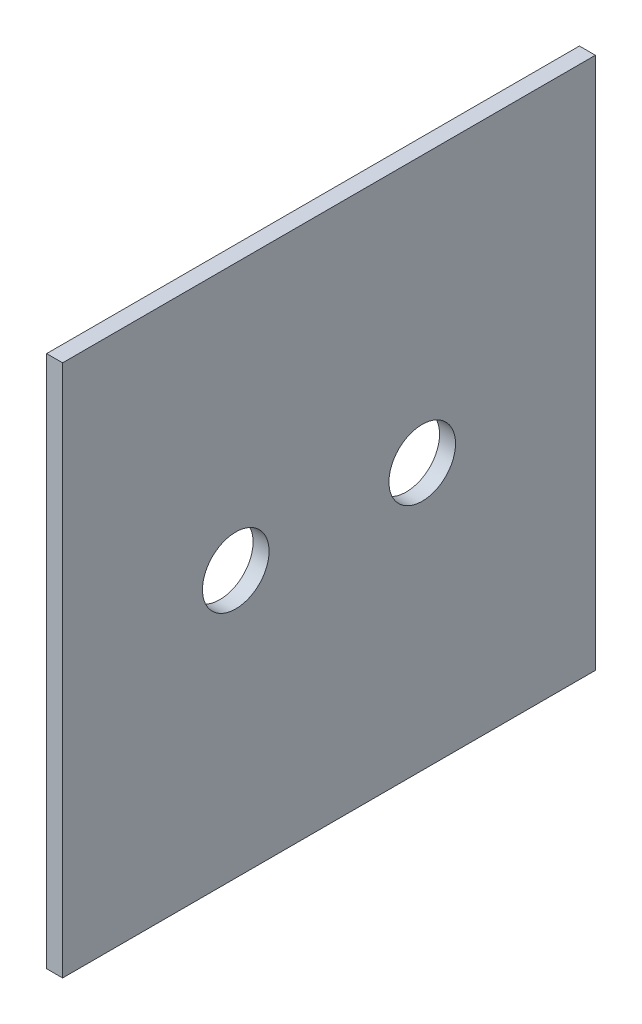
ISO-10303-21;
HEADER;
FILE_DESCRIPTION(('STEP AP214'),'2;1');
FILE_NAME('part.step','',(''),(''),'','','');
FILE_SCHEMA(('AUTOMOTIVE_DESIGN { 1 0 10303 214 1 1 1 1 }'));
ENDSEC;
DATA;
#1=APPLICATION_CONTEXT('core data for automotive mechanical design processes');
#2=APPLICATION_PROTOCOL_DEFINITION('international standard','automotive_design',2000,#1);
#3=PRODUCT_CONTEXT('',#1,'mechanical');
#4=PRODUCT('Part','Part','',(#3));
#5=PRODUCT_RELATED_PRODUCT_CATEGORY('part','',(#4));
#6=PRODUCT_DEFINITION_FORMATION('','',#4);
#7=PRODUCT_DEFINITION_CONTEXT('part definition',#1,'design');
#8=PRODUCT_DEFINITION('design','',#6,#7);
#9=PRODUCT_DEFINITION_SHAPE('','',#8);
#10=(LENGTH_UNIT() NAMED_UNIT(*) SI_UNIT(.MILLI.,.METRE.));
#11=(NAMED_UNIT(*) PLANE_ANGLE_UNIT() SI_UNIT($,.RADIAN.));
#12=(NAMED_UNIT(*) SI_UNIT($,.STERADIAN.) SOLID_ANGLE_UNIT());
#13=UNCERTAINTY_MEASURE_WITH_UNIT(LENGTH_MEASURE(1.E-05),#10,'distance_accuracy_value','');
#14=(GEOMETRIC_REPRESENTATION_CONTEXT(3) GLOBAL_UNCERTAINTY_ASSIGNED_CONTEXT((#13)) GLOBAL_UNIT_ASSIGNED_CONTEXT((#10,
#11,#12)) REPRESENTATION_CONTEXT('',''));
#15=CARTESIAN_POINT('',(0.,0.,0.));
#16=DIRECTION('',(0.,0.,1.));
#17=DIRECTION('',(1.,0.,0.));
#18=AXIS2_PLACEMENT_3D('',#15,#16,#17);
#19=CARTESIAN_POINT('',(6.,0.,0.));
#20=DIRECTION('',(1.,0.,0.));
#21=DIRECTION('',(0.,0.,-1.));
#22=AXIS2_PLACEMENT_3D('',#19,#20,#21);
#23=PLANE('',#22);
#24=CARTESIAN_POINT('',(6.,33.4592391304348,-42.2826086956521));
#25=DIRECTION('',(1.,0.,0.));
#26=DIRECTION('',(0.,0.,-1.));
#27=AXIS2_PLACEMENT_3D('',#24,#25,#26);
#28=CIRCLE('',#27,12.5);
#29=CARTESIAN_POINT('',(6.,33.4592391304348,-54.7826086956521));
#30=VERTEX_POINT('',#29);
#31=EDGE_CURVE('E112',#30,#30,#28,.T.);
#32=ORIENTED_EDGE('',*,*,#31,.F.);
#33=EDGE_LOOP('',(#32));
#34=FACE_BOUND('',#33,.T.);
#35=DIRECTION('',(0.,-1.,0.));
#36=VECTOR('',#35,1.);
#37=CARTESIAN_POINT('',(6.,133.459239130435,92.7173913043479));
#38=LINE('',#37,#36);
#39=CARTESIAN_POINT('',(6.,133.459239130435,92.7173913043479));
#40=VERTEX_POINT('',#39);
#41=CARTESIAN_POINT('',(6.,-66.5407608695652,92.7173913043478));
#42=VERTEX_POINT('',#41);
#43=EDGE_CURVE('E92',#40,#42,#38,.T.);
#44=ORIENTED_EDGE('',*,*,#43,.T.);
#45=DIRECTION('',(0.,0.,-1.));
#46=VECTOR('',#45,1.);
#47=CARTESIAN_POINT('',(6.,-66.5407608695652,92.7173913043478));
#48=LINE('',#47,#46);
#49=CARTESIAN_POINT('',(6.,-66.5407608695652,-107.282608695652));
#50=VERTEX_POINT('',#49);
#51=EDGE_CURVE('E87',#42,#50,#48,.T.);
#52=ORIENTED_EDGE('',*,*,#51,.T.);
#53=DIRECTION('',(0.,1.,0.));
#54=VECTOR('',#53,1.);
#55=CARTESIAN_POINT('',(6.,133.459239130435,-107.282608695652));
#56=LINE('',#55,#54);
#57=CARTESIAN_POINT('',(6.,133.459239130435,-107.282608695652));
#58=VERTEX_POINT('',#57);
#59=EDGE_CURVE('E90',#50,#58,#56,.T.);
#60=ORIENTED_EDGE('',*,*,#59,.T.);
#61=DIRECTION('',(0.,0.,1.));
#62=VECTOR('',#61,1.);
#63=CARTESIAN_POINT('',(6.,133.459239130435,92.7173913043479));
#64=LINE('',#63,#62);
#65=EDGE_CURVE('E57',#58,#40,#64,.T.);
#66=ORIENTED_EDGE('',*,*,#65,.T.);
#67=EDGE_LOOP('',(#44,#52,#60,#66));
#68=FACE_BOUND('',#67,.T.);
#69=CARTESIAN_POINT('',(6.,33.4592391304348,27.7173913043479));
#70=DIRECTION('',(1.,0.,0.));
#71=DIRECTION('',(0.,0.,-1.));
#72=AXIS2_PLACEMENT_3D('',#69,#70,#71);
#73=CIRCLE('',#72,12.5);
#74=CARTESIAN_POINT('',(6.,33.4592391304348,15.2173913043479));
#75=VERTEX_POINT('',#74);
#76=EDGE_CURVE('E134',#75,#75,#73,.T.);
#77=ORIENTED_EDGE('',*,*,#76,.F.);
#78=EDGE_LOOP('',(#77));
#79=FACE_BOUND('',#78,.T.);
#80=ADVANCED_FACE('F39',(#34,#68,#79),#23,.T.);
#81=CARTESIAN_POINT('',(0.,0.,0.));
#82=DIRECTION('',(1.,0.,0.));
#83=DIRECTION('',(0.,0.,-1.));
#84=AXIS2_PLACEMENT_3D('',#81,#82,#83);
#85=PLANE('',#84);
#86=DIRECTION('',(0.,-1.,0.));
#87=VECTOR('',#86,1.);
#88=CARTESIAN_POINT('',(0.,133.459239130435,92.7173913043479));
#89=LINE('',#88,#87);
#90=CARTESIAN_POINT('',(0.,133.459239130435,92.7173913043479));
#91=VERTEX_POINT('',#90);
#92=CARTESIAN_POINT('',(0.,-66.5407608695652,92.7173913043478));
#93=VERTEX_POINT('',#92);
#94=EDGE_CURVE('E108',#91,#93,#89,.T.);
#95=ORIENTED_EDGE('',*,*,#94,.F.);
#96=DIRECTION('',(0.,0.,1.));
#97=VECTOR('',#96,1.);
#98=CARTESIAN_POINT('',(0.,133.459239130435,92.7173913043479));
#99=LINE('',#98,#97);
#100=CARTESIAN_POINT('',(0.,133.459239130435,-107.282608695652));
#101=VERTEX_POINT('',#100);
#102=EDGE_CURVE('E80',#101,#91,#99,.T.);
#103=ORIENTED_EDGE('',*,*,#102,.F.);
#104=DIRECTION('',(0.,1.,0.));
#105=VECTOR('',#104,1.);
#106=CARTESIAN_POINT('',(0.,133.459239130435,-107.282608695652));
#107=LINE('',#106,#105);
#108=CARTESIAN_POINT('',(0.,-66.5407608695652,-107.282608695652));
#109=VERTEX_POINT('',#108);
#110=EDGE_CURVE('E74',#109,#101,#107,.T.);
#111=ORIENTED_EDGE('',*,*,#110,.F.);
#112=DIRECTION('',(0.,0.,-1.));
#113=VECTOR('',#112,1.);
#114=CARTESIAN_POINT('',(0.,-66.5407608695652,92.7173913043478));
#115=LINE('',#114,#113);
#116=EDGE_CURVE('E97',#93,#109,#115,.T.);
#117=ORIENTED_EDGE('',*,*,#116,.F.);
#118=EDGE_LOOP('',(#95,#103,#111,#117));
#119=FACE_BOUND('',#118,.T.);
#120=CARTESIAN_POINT('',(0.,33.4592391304348,-42.2826086956521));
#121=DIRECTION('',(1.,0.,0.));
#122=DIRECTION('',(0.,0.,-1.));
#123=AXIS2_PLACEMENT_3D('',#120,#121,#122);
#124=CIRCLE('',#123,12.5);
#125=CARTESIAN_POINT('',(0.,33.4592391304348,-54.7826086956521));
#126=VERTEX_POINT('',#125);
#127=EDGE_CURVE('E130',#126,#126,#124,.T.);
#128=ORIENTED_EDGE('',*,*,#127,.T.);
#129=EDGE_LOOP('',(#128));
#130=FACE_BOUND('',#129,.T.);
#131=CARTESIAN_POINT('',(0.,33.4592391304348,27.7173913043479));
#132=DIRECTION('',(1.,0.,0.));
#133=DIRECTION('',(0.,0.,-1.));
#134=AXIS2_PLACEMENT_3D('',#131,#132,#133);
#135=CIRCLE('',#134,12.5);
#136=CARTESIAN_POINT('',(0.,33.4592391304348,15.2173913043479));
#137=VERTEX_POINT('',#136);
#138=EDGE_CURVE('E138',#137,#137,#135,.T.);
#139=ORIENTED_EDGE('',*,*,#138,.T.);
#140=EDGE_LOOP('',(#139));
#141=FACE_BOUND('',#140,.T.);
#142=ADVANCED_FACE('F125',(#119,#130,#141),#85,.F.);
#143=CARTESIAN_POINT('',(6.,133.459239130435,92.7173913043479));
#144=DIRECTION('',(0.,0.,-1.));
#145=DIRECTION('',(0.,1.,0.));
#146=AXIS2_PLACEMENT_3D('',#143,#144,#145);
#147=PLANE('',#146);
#148=ORIENTED_EDGE('',*,*,#94,.T.);
#149=DIRECTION('',(-1.,0.,0.));
#150=VECTOR('',#149,1.);
#151=CARTESIAN_POINT('',(6.,-66.5407608695652,92.7173913043478));
#152=LINE('',#151,#150);
#153=EDGE_CURVE('E11',#42,#93,#152,.T.);
#154=ORIENTED_EDGE('',*,*,#153,.F.);
#155=ORIENTED_EDGE('',*,*,#43,.F.);
#156=DIRECTION('',(-1.,0.,0.));
#157=VECTOR('',#156,1.);
#158=CARTESIAN_POINT('',(6.,133.459239130435,92.7173913043479));
#159=LINE('',#158,#157);
#160=EDGE_CURVE('E104',#40,#91,#159,.T.);
#161=ORIENTED_EDGE('',*,*,#160,.T.);
#162=EDGE_LOOP('',(#148,#154,#155,#161));
#163=FACE_BOUND('',#162,.T.);
#164=ADVANCED_FACE('F41',(#163),#147,.F.);
#165=CARTESIAN_POINT('',(6.,-66.5407608695652,92.7173913043478));
#166=DIRECTION('',(0.,1.,0.));
#167=DIRECTION('',(0.,0.,1.));
#168=AXIS2_PLACEMENT_3D('',#165,#166,#167);
#169=PLANE('',#168);
#170=ORIENTED_EDGE('',*,*,#116,.T.);
#171=DIRECTION('',(-1.,0.,0.));
#172=VECTOR('',#171,1.);
#173=CARTESIAN_POINT('',(6.,-66.5407608695652,-107.282608695652));
#174=LINE('',#173,#172);
#175=EDGE_CURVE('E49',#50,#109,#174,.T.);
#176=ORIENTED_EDGE('',*,*,#175,.F.);
#177=ORIENTED_EDGE('',*,*,#51,.F.);
#178=ORIENTED_EDGE('',*,*,#153,.T.);
#179=EDGE_LOOP('',(#170,#176,#177,#178));
#180=FACE_BOUND('',#179,.T.);
#181=ADVANCED_FACE('F96',(#180),#169,.F.);
#182=CARTESIAN_POINT('',(6.,133.459239130435,-107.282608695652));
#183=DIRECTION('',(0.,0.,1.));
#184=DIRECTION('',(0.,-1.,0.));
#185=AXIS2_PLACEMENT_3D('',#182,#183,#184);
#186=PLANE('',#185);
#187=ORIENTED_EDGE('',*,*,#110,.T.);
#188=DIRECTION('',(-1.,0.,0.));
#189=VECTOR('',#188,1.);
#190=CARTESIAN_POINT('',(6.,133.459239130435,-107.282608695652));
#191=LINE('',#190,#189);
#192=EDGE_CURVE('E99',#58,#101,#191,.T.);
#193=ORIENTED_EDGE('',*,*,#192,.F.);
#194=ORIENTED_EDGE('',*,*,#59,.F.);
#195=ORIENTED_EDGE('',*,*,#175,.T.);
#196=EDGE_LOOP('',(#187,#193,#194,#195));
#197=FACE_BOUND('',#196,.T.);
#198=ADVANCED_FACE('F100',(#197),#186,.F.);
#199=CARTESIAN_POINT('',(6.,133.459239130435,92.7173913043479));
#200=DIRECTION('',(0.,-1.,0.));
#201=DIRECTION('',(0.,0.,-1.));
#202=AXIS2_PLACEMENT_3D('',#199,#200,#201);
#203=PLANE('',#202);
#204=ORIENTED_EDGE('',*,*,#102,.T.);
#205=ORIENTED_EDGE('',*,*,#160,.F.);
#206=ORIENTED_EDGE('',*,*,#65,.F.);
#207=ORIENTED_EDGE('',*,*,#192,.T.);
#208=EDGE_LOOP('',(#204,#205,#206,#207));
#209=FACE_BOUND('',#208,.T.);
#210=ADVANCED_FACE('F122',(#209),#203,.F.);
#211=CARTESIAN_POINT('',(6.,33.4592391304348,-42.2826086956521));
#212=DIRECTION('',(-1.,0.,0.));
#213=DIRECTION('',(0.,0.,1.));
#214=AXIS2_PLACEMENT_3D('',#211,#212,#213);
#215=CYLINDRICAL_SURFACE('',#214,12.5);
#216=ORIENTED_EDGE('',*,*,#31,.T.);
#217=EDGE_LOOP('',(#216));
#218=FACE_BOUND('',#217,.T.);
#219=ORIENTED_EDGE('',*,*,#127,.F.);
#220=EDGE_LOOP('',(#219));
#221=FACE_BOUND('',#220,.T.);
#222=ADVANCED_FACE('F157',(#218,#221),#215,.F.);
#223=CARTESIAN_POINT('',(6.,33.4592391304348,27.7173913043479));
#224=DIRECTION('',(-1.,0.,0.));
#225=DIRECTION('',(0.,0.,1.));
#226=AXIS2_PLACEMENT_3D('',#223,#224,#225);
#227=CYLINDRICAL_SURFACE('',#226,12.5);
#228=ORIENTED_EDGE('',*,*,#76,.T.);
#229=EDGE_LOOP('',(#228));
#230=FACE_BOUND('',#229,.T.);
#231=ORIENTED_EDGE('',*,*,#138,.F.);
#232=EDGE_LOOP('',(#231));
#233=FACE_BOUND('',#232,.T.);
#234=ADVANCED_FACE('F146',(#230,#233),#227,.F.);
#235=CLOSED_SHELL('',(#80,#142,#164,#181,#198,#210,#222,#234));
#236=MANIFOLD_SOLID_BREP('B2',#235);
#237=ADVANCED_BREP_SHAPE_REPRESENTATION('',(#18,#236),#14);
#238=SHAPE_DEFINITION_REPRESENTATION(#9,#237);
ENDSEC;
END-ISO-10303-21;
